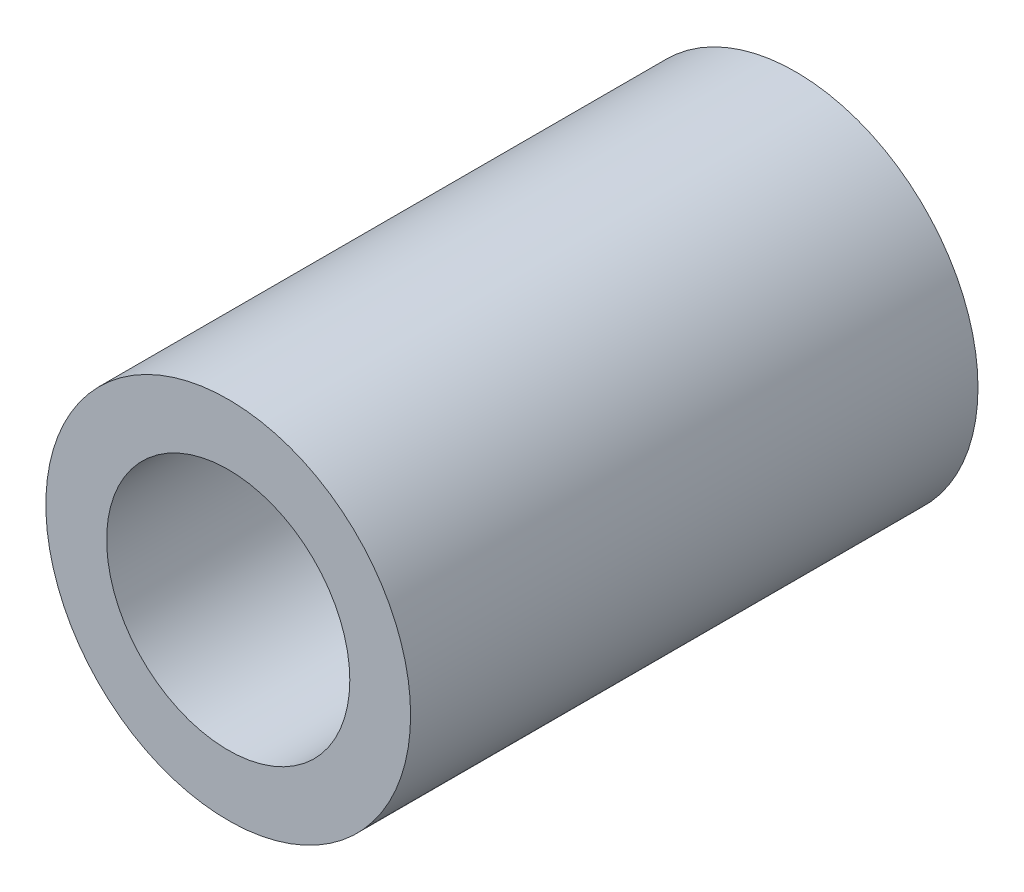
ISO-10303-21;
HEADER;
FILE_DESCRIPTION(('STEP AP214'),'2;1');
FILE_NAME('part.step','',(''),(''),'','','');
FILE_SCHEMA(('AUTOMOTIVE_DESIGN { 1 0 10303 214 1 1 1 1 }'));
ENDSEC;
DATA;
#1=APPLICATION_CONTEXT('core data for automotive mechanical design processes');
#2=APPLICATION_PROTOCOL_DEFINITION('international standard','automotive_design',2000,#1);
#3=PRODUCT_CONTEXT('',#1,'mechanical');
#4=PRODUCT('Part','Part','',(#3));
#5=PRODUCT_RELATED_PRODUCT_CATEGORY('part','',(#4));
#6=PRODUCT_DEFINITION_FORMATION('','',#4);
#7=PRODUCT_DEFINITION_CONTEXT('part definition',#1,'design');
#8=PRODUCT_DEFINITION('design','',#6,#7);
#9=PRODUCT_DEFINITION_SHAPE('','',#8);
#10=(LENGTH_UNIT() NAMED_UNIT(*) SI_UNIT(.MILLI.,.METRE.));
#11=(NAMED_UNIT(*) PLANE_ANGLE_UNIT() SI_UNIT($,.RADIAN.));
#12=(NAMED_UNIT(*) SI_UNIT($,.STERADIAN.) SOLID_ANGLE_UNIT());
#13=UNCERTAINTY_MEASURE_WITH_UNIT(LENGTH_MEASURE(1.E-05),#10,'distance_accuracy_value','');
#14=(GEOMETRIC_REPRESENTATION_CONTEXT(3) GLOBAL_UNCERTAINTY_ASSIGNED_CONTEXT((#13)) GLOBAL_UNIT_ASSIGNED_CONTEXT((#10,
#11,#12)) REPRESENTATION_CONTEXT('',''));
#15=CARTESIAN_POINT('',(0.,0.,0.));
#16=DIRECTION('',(0.,0.,1.));
#17=DIRECTION('',(1.,0.,0.));
#18=AXIS2_PLACEMENT_3D('',#15,#16,#17);
#19=CARTESIAN_POINT('',(0.,0.,-56.));
#20=DIRECTION('',(0.,0.,1.));
#21=DIRECTION('',(1.,0.,0.));
#22=AXIS2_PLACEMENT_3D('',#19,#20,#21);
#23=CYLINDRICAL_SURFACE('',#22,12.);
#24=CARTESIAN_POINT('',(0.,0.,-56.));
#25=DIRECTION('',(0.,0.,1.));
#26=DIRECTION('',(1.,0.,0.));
#27=AXIS2_PLACEMENT_3D('',#24,#25,#26);
#28=CIRCLE('',#27,12.);
#29=CARTESIAN_POINT('',(12.,0.,-56.));
#30=VERTEX_POINT('',#29);
#31=EDGE_CURVE('E44',#30,#30,#28,.T.);
#32=ORIENTED_EDGE('',*,*,#31,.F.);
#33=EDGE_LOOP('',(#32));
#34=FACE_BOUND('',#33,.T.);
#35=CARTESIAN_POINT('',(0.,0.,0.));
#36=DIRECTION('',(0.,0.,1.));
#37=DIRECTION('',(1.,0.,0.));
#38=AXIS2_PLACEMENT_3D('',#35,#36,#37);
#39=CIRCLE('',#38,12.);
#40=CARTESIAN_POINT('',(12.,0.,0.));
#41=VERTEX_POINT('',#40);
#42=EDGE_CURVE('E50',#41,#41,#39,.T.);
#43=ORIENTED_EDGE('',*,*,#42,.T.);
#44=EDGE_LOOP('',(#43));
#45=FACE_BOUND('',#44,.T.);
#46=ADVANCED_FACE('F37',(#34,#45),#23,.F.);
#47=CARTESIAN_POINT('',(0.,0.,-56.));
#48=DIRECTION('',(0.,0.,1.));
#49=DIRECTION('',(1.,0.,0.));
#50=AXIS2_PLACEMENT_3D('',#47,#48,#49);
#51=CYLINDRICAL_SURFACE('',#50,18.);
#52=CARTESIAN_POINT('',(0.,0.,-56.));
#53=DIRECTION('',(0.,0.,1.));
#54=DIRECTION('',(1.,0.,0.));
#55=AXIS2_PLACEMENT_3D('',#52,#53,#54);
#56=CIRCLE('',#55,18.);
#57=CARTESIAN_POINT('',(18.,0.,-56.));
#58=VERTEX_POINT('',#57);
#59=EDGE_CURVE('E10',#58,#58,#56,.T.);
#60=ORIENTED_EDGE('',*,*,#59,.T.);
#61=EDGE_LOOP('',(#60));
#62=FACE_BOUND('',#61,.T.);
#63=CARTESIAN_POINT('',(0.,0.,0.));
#64=DIRECTION('',(0.,0.,1.));
#65=DIRECTION('',(1.,0.,0.));
#66=AXIS2_PLACEMENT_3D('',#63,#64,#65);
#67=CIRCLE('',#66,18.);
#68=CARTESIAN_POINT('',(18.,0.,0.));
#69=VERTEX_POINT('',#68);
#70=EDGE_CURVE('E40',#69,#69,#67,.T.);
#71=ORIENTED_EDGE('',*,*,#70,.F.);
#72=EDGE_LOOP('',(#71));
#73=FACE_BOUND('',#72,.T.);
#74=ADVANCED_FACE('F59',(#62,#73),#51,.T.);
#75=CARTESIAN_POINT('',(0.,0.,-56.));
#76=DIRECTION('',(0.,0.,1.));
#77=DIRECTION('',(1.,0.,0.));
#78=AXIS2_PLACEMENT_3D('',#75,#76,#77);
#79=PLANE('',#78);
#80=ORIENTED_EDGE('',*,*,#31,.T.);
#81=EDGE_LOOP('',(#80));
#82=FACE_BOUND('',#81,.T.);
#83=ORIENTED_EDGE('',*,*,#59,.F.);
#84=EDGE_LOOP('',(#83));
#85=FACE_BOUND('',#84,.T.);
#86=ADVANCED_FACE('F61',(#82,#85),#79,.F.);
#87=CARTESIAN_POINT('',(0.,0.,0.));
#88=DIRECTION('',(0.,0.,1.));
#89=DIRECTION('',(1.,0.,0.));
#90=AXIS2_PLACEMENT_3D('',#87,#88,#89);
#91=PLANE('',#90);
#92=ORIENTED_EDGE('',*,*,#42,.F.);
#93=EDGE_LOOP('',(#92));
#94=FACE_BOUND('',#93,.T.);
#95=ORIENTED_EDGE('',*,*,#70,.T.);
#96=EDGE_LOOP('',(#95));
#97=FACE_BOUND('',#96,.T.);
#98=ADVANCED_FACE('F57',(#94,#97),#91,.T.);
#99=CLOSED_SHELL('',(#46,#74,#86,#98));
#100=MANIFOLD_SOLID_BREP('B2',#99);
#101=ADVANCED_BREP_SHAPE_REPRESENTATION('',(#18,#100),#14);
#102=SHAPE_DEFINITION_REPRESENTATION(#9,#101);
ENDSEC;
END-ISO-10303-21;
